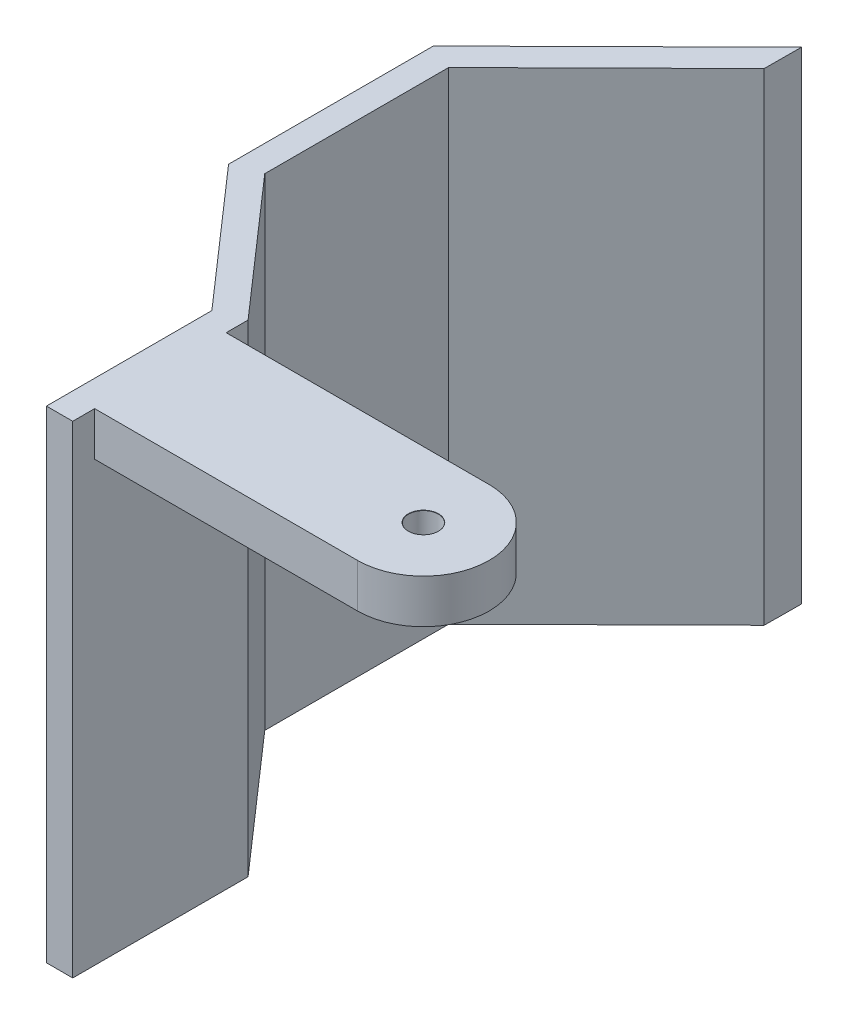
ISO-10303-21;
HEADER;
FILE_DESCRIPTION(('STEP AP214'),'2;1');
FILE_NAME('part.step','',(''),(''),'','','');
FILE_SCHEMA(('AUTOMOTIVE_DESIGN { 1 0 10303 214 1 1 1 1 }'));
ENDSEC;
DATA;
#1=APPLICATION_CONTEXT('core data for automotive mechanical design processes');
#2=APPLICATION_PROTOCOL_DEFINITION('international standard','automotive_design',2000,#1);
#3=PRODUCT_CONTEXT('',#1,'mechanical');
#4=PRODUCT('Part','Part','',(#3));
#5=PRODUCT_RELATED_PRODUCT_CATEGORY('part','',(#4));
#6=PRODUCT_DEFINITION_FORMATION('','',#4);
#7=PRODUCT_DEFINITION_CONTEXT('part definition',#1,'design');
#8=PRODUCT_DEFINITION('design','',#6,#7);
#9=PRODUCT_DEFINITION_SHAPE('','',#8);
#10=(LENGTH_UNIT() NAMED_UNIT(*) SI_UNIT(.MILLI.,.METRE.));
#11=(NAMED_UNIT(*) PLANE_ANGLE_UNIT() SI_UNIT($,.RADIAN.));
#12=(NAMED_UNIT(*) SI_UNIT($,.STERADIAN.) SOLID_ANGLE_UNIT());
#13=UNCERTAINTY_MEASURE_WITH_UNIT(LENGTH_MEASURE(1.E-05),#10,'distance_accuracy_value','');
#14=(GEOMETRIC_REPRESENTATION_CONTEXT(3) GLOBAL_UNCERTAINTY_ASSIGNED_CONTEXT((#13)) GLOBAL_UNIT_ASSIGNED_CONTEXT((#10,
#11,#12)) REPRESENTATION_CONTEXT('',''));
#15=CARTESIAN_POINT('',(0.,0.,0.));
#16=DIRECTION('',(0.,0.,1.));
#17=DIRECTION('',(1.,0.,0.));
#18=AXIS2_PLACEMENT_3D('',#15,#16,#17);
#19=CARTESIAN_POINT('',(0.,55.,0.));
#20=DIRECTION('',(0.,0.,1.));
#21=DIRECTION('',(1.,0.,0.));
#22=AXIS2_PLACEMENT_3D('',#19,#20,#21);
#23=PLANE('',#22);
#24=DIRECTION('',(-1.,0.,0.));
#25=VECTOR('',#24,1.);
#26=CARTESIAN_POINT('',(0.,0.,0.));
#27=LINE('',#26,#25);
#28=CARTESIAN_POINT('',(3.,0.,0.));
#29=VERTEX_POINT('',#28);
#30=CARTESIAN_POINT('',(0.,0.,0.));
#31=VERTEX_POINT('',#30);
#32=EDGE_CURVE('E158',#29,#31,#27,.T.);
#33=ORIENTED_EDGE('',*,*,#32,.F.);
#34=DIRECTION('',(0.,-1.,0.));
#35=VECTOR('',#34,1.);
#36=CARTESIAN_POINT('',(3.,55.,0.));
#37=LINE('',#36,#35);
#38=CARTESIAN_POINT('',(3.,55.,0.));
#39=VERTEX_POINT('',#38);
#40=EDGE_CURVE('E11',#39,#29,#37,.T.);
#41=ORIENTED_EDGE('',*,*,#40,.F.);
#42=DIRECTION('',(-1.,0.,0.));
#43=VECTOR('',#42,1.);
#44=CARTESIAN_POINT('',(0.,55.,0.));
#45=LINE('',#44,#43);
#46=CARTESIAN_POINT('',(0.,55.,0.));
#47=VERTEX_POINT('',#46);
#48=EDGE_CURVE('E181',#39,#47,#45,.T.);
#49=ORIENTED_EDGE('',*,*,#48,.T.);
#50=DIRECTION('',(0.,-1.,0.));
#51=VECTOR('',#50,1.);
#52=CARTESIAN_POINT('',(0.,55.,0.));
#53=LINE('',#52,#51);
#54=EDGE_CURVE('E65',#47,#31,#53,.T.);
#55=ORIENTED_EDGE('',*,*,#54,.T.);
#56=EDGE_LOOP('',(#33,#41,#49,#55));
#57=FACE_BOUND('',#56,.T.);
#58=ADVANCED_FACE('F41',(#57),#23,.T.);
#59=CARTESIAN_POINT('',(3.,55.,0.));
#60=DIRECTION('',(-1.,0.,0.));
#61=DIRECTION('',(0.,0.,1.));
#62=AXIS2_PLACEMENT_3D('',#59,#60,#61);
#63=PLANE('',#62);
#64=DIRECTION('',(0.,0.,-1.));
#65=VECTOR('',#64,1.);
#66=CARTESIAN_POINT('',(3.,55.,0.));
#67=LINE('',#66,#65);
#68=CARTESIAN_POINT('',(3.,55.,-17.5));
#69=VERTEX_POINT('',#68);
#70=CARTESIAN_POINT('',(3.,55.,-20.));
#71=VERTEX_POINT('',#70);
#72=EDGE_CURVE('E237',#69,#71,#67,.T.);
#73=ORIENTED_EDGE('',*,*,#72,.F.);
#74=DIRECTION('',(0.,1.,0.));
#75=VECTOR('',#74,1.);
#76=CARTESIAN_POINT('',(3.,50.,-17.5));
#77=LINE('',#76,#75);
#78=CARTESIAN_POINT('',(3.,50.,-17.5));
#79=VERTEX_POINT('',#78);
#80=EDGE_CURVE('E161',#79,#69,#77,.T.);
#81=ORIENTED_EDGE('',*,*,#80,.F.);
#82=DIRECTION('',(0.,0.,1.));
#83=VECTOR('',#82,1.);
#84=CARTESIAN_POINT('',(3.,50.,0.));
#85=LINE('',#84,#83);
#86=CARTESIAN_POINT('',(3.,50.,-2.5));
#87=VERTEX_POINT('',#86);
#88=EDGE_CURVE('E249',#79,#87,#85,.T.);
#89=ORIENTED_EDGE('',*,*,#88,.T.);
#90=DIRECTION('',(0.,1.,0.));
#91=VECTOR('',#90,1.);
#92=CARTESIAN_POINT('',(3.,50.,-2.5));
#93=LINE('',#92,#91);
#94=CARTESIAN_POINT('',(3.,55.,-2.5));
#95=VERTEX_POINT('',#94);
#96=EDGE_CURVE('E241',#87,#95,#93,.T.);
#97=ORIENTED_EDGE('',*,*,#96,.T.);
#98=EDGE_CURVE('E236',#39,#95,#67,.T.);
#99=ORIENTED_EDGE('',*,*,#98,.F.);
#100=ORIENTED_EDGE('',*,*,#40,.T.);
#101=DIRECTION('',(0.,0.,-1.));
#102=VECTOR('',#101,1.);
#103=CARTESIAN_POINT('',(3.,0.,0.));
#104=LINE('',#103,#102);
#105=CARTESIAN_POINT('',(3.,0.,-20.));
#106=VERTEX_POINT('',#105);
#107=EDGE_CURVE('E160',#29,#106,#104,.T.);
#108=ORIENTED_EDGE('',*,*,#107,.T.);
#109=DIRECTION('',(0.,-1.,0.));
#110=VECTOR('',#109,1.);
#111=CARTESIAN_POINT('',(3.,55.,-20.));
#112=LINE('',#111,#110);
#113=EDGE_CURVE('E49',#71,#106,#112,.T.);
#114=ORIENTED_EDGE('',*,*,#113,.F.);
#115=EDGE_LOOP('',(#73,#81,#89,#97,#99,#100,#108,#114));
#116=FACE_BOUND('',#115,.T.);
#117=ADVANCED_FACE('F244',(#116),#63,.F.);
#118=CARTESIAN_POINT('',(11.6103440031896,55.,-10.1759094573042));
#119=DIRECTION('',(-0.752035287081566,0.,0.659122846656181));
#120=DIRECTION('',(0.659122846656181,0.,0.752035287081566));
#121=AXIS2_PLACEMENT_3D('',#118,#119,#120);
#122=PLANE('',#121);
#123=DIRECTION('',(-0.659122846656181,0.,-0.752035287081566));
#124=VECTOR('',#123,1.);
#125=CARTESIAN_POINT('',(11.6103440031896,0.,-10.1759094573042));
#126=LINE('',#125,#124);
#127=CARTESIAN_POINT('',(-10.505514798512,0.,-35.409303061196));
#128=VERTEX_POINT('',#127);
#129=EDGE_CURVE('E163',#106,#128,#126,.T.);
#130=ORIENTED_EDGE('',*,*,#129,.T.);
#131=DIRECTION('',(0.,-1.,0.));
#132=VECTOR('',#131,1.);
#133=CARTESIAN_POINT('',(-10.505514798512,55.,-35.409303061196));
#134=LINE('',#133,#132);
#135=CARTESIAN_POINT('',(-10.505514798512,55.,-35.409303061196));
#136=VERTEX_POINT('',#135);
#137=EDGE_CURVE('E193',#136,#128,#134,.T.);
#138=ORIENTED_EDGE('',*,*,#137,.F.);
#139=DIRECTION('',(-0.659122846656181,0.,-0.752035287081566));
#140=VECTOR('',#139,1.);
#141=CARTESIAN_POINT('',(11.6103440031896,55.,-10.1759094573042));
#142=LINE('',#141,#140);
#143=EDGE_CURVE('E203',#71,#136,#142,.T.);
#144=ORIENTED_EDGE('',*,*,#143,.F.);
#145=ORIENTED_EDGE('',*,*,#113,.T.);
#146=EDGE_LOOP('',(#130,#138,#144,#145));
#147=FACE_BOUND('',#146,.T.);
#148=ADVANCED_FACE('F201',(#147),#122,.F.);
#149=CARTESIAN_POINT('',(-10.505514798512,55.,0.));
#150=DIRECTION('',(-1.,0.,0.));
#151=DIRECTION('',(0.,0.,1.));
#152=AXIS2_PLACEMENT_3D('',#149,#150,#151);
#153=PLANE('',#152);
#154=DIRECTION('',(0.,0.,-1.));
#155=VECTOR('',#154,1.);
#156=CARTESIAN_POINT('',(-10.505514798512,0.,0.));
#157=LINE('',#156,#155);
#158=CARTESIAN_POINT('',(-10.505514798512,0.,-56.3844767940236));
#159=VERTEX_POINT('',#158);
#160=EDGE_CURVE('E165',#128,#159,#157,.T.);
#161=ORIENTED_EDGE('',*,*,#160,.T.);
#162=DIRECTION('',(0.,-1.,0.));
#163=VECTOR('',#162,1.);
#164=CARTESIAN_POINT('',(-10.505514798512,55.,-56.3844767940236));
#165=LINE('',#164,#163);
#166=CARTESIAN_POINT('',(-10.505514798512,55.,-56.3844767940236));
#167=VERTEX_POINT('',#166);
#168=EDGE_CURVE('E190',#167,#159,#165,.T.);
#169=ORIENTED_EDGE('',*,*,#168,.F.);
#170=DIRECTION('',(0.,0.,-1.));
#171=VECTOR('',#170,1.);
#172=CARTESIAN_POINT('',(-10.505514798512,55.,0.));
#173=LINE('',#172,#171);
#174=EDGE_CURVE('E223',#136,#167,#173,.T.);
#175=ORIENTED_EDGE('',*,*,#174,.F.);
#176=ORIENTED_EDGE('',*,*,#137,.T.);
#177=EDGE_LOOP('',(#161,#169,#175,#176));
#178=FACE_BOUND('',#177,.T.);
#179=ADVANCED_FACE('F214',(#178),#153,.F.);
#180=CARTESIAN_POINT('',(-33.3838448037325,55.,-33.7632066765023));
#181=DIRECTION('',(-0.70310060646766,0.,-0.711090386086614));
#182=DIRECTION('',(-0.711090386086614,0.,0.70310060646766));
#183=AXIS2_PLACEMENT_3D('',#180,#181,#182);
#184=PLANE('',#183);
#185=DIRECTION('',(0.711090386086614,0.,-0.70310060646766));
#186=VECTOR('',#185,1.);
#187=CARTESIAN_POINT('',(-33.3838448037325,0.,-33.7632066765023));
#188=LINE('',#187,#186);
#189=CARTESIAN_POINT('',(7.59252972399853,0.,-74.2791725016744));
#190=VERTEX_POINT('',#189);
#191=EDGE_CURVE('E167',#159,#190,#188,.T.);
#192=ORIENTED_EDGE('',*,*,#191,.T.);
#193=DIRECTION('',(0.,-1.,0.));
#194=VECTOR('',#193,1.);
#195=CARTESIAN_POINT('',(7.59252972399853,55.,-74.2791725016744));
#196=LINE('',#195,#194);
#197=CARTESIAN_POINT('',(7.59252972399853,55.,-74.2791725016744));
#198=VERTEX_POINT('',#197);
#199=EDGE_CURVE('E187',#198,#190,#196,.T.);
#200=ORIENTED_EDGE('',*,*,#199,.F.);
#201=DIRECTION('',(0.711090386086614,0.,-0.70310060646766));
#202=VECTOR('',#201,1.);
#203=CARTESIAN_POINT('',(-33.3838448037325,55.,-33.7632066765023));
#204=LINE('',#203,#202);
#205=EDGE_CURVE('E220',#167,#198,#204,.T.);
#206=ORIENTED_EDGE('',*,*,#205,.F.);
#207=ORIENTED_EDGE('',*,*,#168,.T.);
#208=EDGE_LOOP('',(#192,#200,#206,#207));
#209=FACE_BOUND('',#208,.T.);
#210=ADVANCED_FACE('F218',(#209),#184,.F.);
#211=CARTESIAN_POINT('',(7.17264443633418,55.,0.0405234148945547));
#212=DIRECTION('',(-0.999984040728061,0.,-0.00564962734874768));
#213=DIRECTION('',(-0.00564962734874768,0.,0.999984040728061));
#214=AXIS2_PLACEMENT_3D('',#211,#212,#213);
#215=PLANE('',#214);
#216=DIRECTION('',(0.00564962734874768,0.,-0.999984040728061));
#217=VECTOR('',#216,1.);
#218=CARTESIAN_POINT('',(7.17264443633418,0.,0.0405234148945547));
#219=LINE('',#218,#217);
#220=CARTESIAN_POINT('',(7.61649906285539,0.,-78.5217454793372));
#221=VERTEX_POINT('',#220);
#222=EDGE_CURVE('E169',#190,#221,#219,.T.);
#223=ORIENTED_EDGE('',*,*,#222,.T.);
#224=DIRECTION('',(0.,-1.,0.));
#225=VECTOR('',#224,1.);
#226=CARTESIAN_POINT('',(7.61649906285539,55.,-78.5217454793372));
#227=LINE('',#226,#225);
#228=CARTESIAN_POINT('',(7.61649906285539,55.,-78.5217454793372));
#229=VERTEX_POINT('',#228);
#230=EDGE_CURVE('E185',#229,#221,#227,.T.);
#231=ORIENTED_EDGE('',*,*,#230,.F.);
#232=DIRECTION('',(0.00564962734874768,0.,-0.999984040728061));
#233=VECTOR('',#232,1.);
#234=CARTESIAN_POINT('',(7.17264443633418,55.,0.0405234148945547));
#235=LINE('',#234,#233);
#236=EDGE_CURVE('E222',#198,#229,#235,.T.);
#237=ORIENTED_EDGE('',*,*,#236,.F.);
#238=ORIENTED_EDGE('',*,*,#199,.T.);
#239=EDGE_LOOP('',(#223,#231,#237,#238));
#240=FACE_BOUND('',#239,.T.);
#241=ADVANCED_FACE('F318',(#240),#215,.F.);
#242=CARTESIAN_POINT('',(-35.4931466231355,55.,-35.8964778347622));
#243=DIRECTION('',(-0.70310060646766,0.,-0.711090386086614));
#244=DIRECTION('',(-0.711090386086614,0.,0.70310060646766));
#245=AXIS2_PLACEMENT_3D('',#242,#243,#244);
#246=PLANE('',#245);
#247=DIRECTION('',(0.711090386086614,0.,-0.70310060646766));
#248=VECTOR('',#247,1.);
#249=CARTESIAN_POINT('',(-35.4931466231355,0.,-35.8964778347622));
#250=LINE('',#249,#248);
#251=CARTESIAN_POINT('',(-13.505514798512,0.,-57.6370576164122));
#252=VERTEX_POINT('',#251);
#253=EDGE_CURVE('E172',#252,#221,#250,.T.);
#254=ORIENTED_EDGE('',*,*,#253,.F.);
#255=DIRECTION('',(0.,-1.,0.));
#256=VECTOR('',#255,1.);
#257=CARTESIAN_POINT('',(-13.505514798512,55.,-57.6370576164122));
#258=LINE('',#257,#256);
#259=CARTESIAN_POINT('',(-13.505514798512,55.,-57.6370576164122));
#260=VERTEX_POINT('',#259);
#261=EDGE_CURVE('E140',#260,#252,#258,.T.);
#262=ORIENTED_EDGE('',*,*,#261,.F.);
#263=DIRECTION('',(0.711090386086614,0.,-0.70310060646766));
#264=VECTOR('',#263,1.);
#265=CARTESIAN_POINT('',(-35.4931466231355,55.,-35.8964778347622));
#266=LINE('',#265,#264);
#267=EDGE_CURVE('E150',#260,#229,#266,.T.);
#268=ORIENTED_EDGE('',*,*,#267,.T.);
#269=ORIENTED_EDGE('',*,*,#230,.T.);
#270=EDGE_LOOP('',(#254,#262,#268,#269));
#271=FACE_BOUND('',#270,.T.);
#272=ADVANCED_FACE('F230',(#271),#246,.T.);
#273=CARTESIAN_POINT('',(-13.505514798512,55.,0.));
#274=DIRECTION('',(-1.,0.,0.));
#275=DIRECTION('',(0.,0.,1.));
#276=AXIS2_PLACEMENT_3D('',#273,#274,#275);
#277=PLANE('',#276);
#278=DIRECTION('',(0.,0.,-1.));
#279=VECTOR('',#278,1.);
#280=CARTESIAN_POINT('',(-13.505514798512,0.,0.));
#281=LINE('',#280,#279);
#282=CARTESIAN_POINT('',(-13.505514798512,0.,-34.2806907812103));
#283=VERTEX_POINT('',#282);
#284=EDGE_CURVE('E135',#283,#252,#281,.T.);
#285=ORIENTED_EDGE('',*,*,#284,.F.);
#286=DIRECTION('',(0.,-1.,0.));
#287=VECTOR('',#286,1.);
#288=CARTESIAN_POINT('',(-13.505514798512,55.,-34.2806907812103));
#289=LINE('',#288,#287);
#290=CARTESIAN_POINT('',(-13.505514798512,55.,-34.2806907812103));
#291=VERTEX_POINT('',#290);
#292=EDGE_CURVE('E130',#291,#283,#289,.T.);
#293=ORIENTED_EDGE('',*,*,#292,.F.);
#294=DIRECTION('',(0.,0.,-1.));
#295=VECTOR('',#294,1.);
#296=CARTESIAN_POINT('',(-13.505514798512,55.,0.));
#297=LINE('',#296,#295);
#298=EDGE_CURVE('E133',#291,#260,#297,.T.);
#299=ORIENTED_EDGE('',*,*,#298,.T.);
#300=ORIENTED_EDGE('',*,*,#261,.T.);
#301=EDGE_LOOP('',(#285,#293,#299,#300));
#302=FACE_BOUND('',#301,.T.);
#303=ADVANCED_FACE('F132',(#302),#277,.T.);
#304=CARTESIAN_POINT('',(9.35423814194485,55.,-8.19854091733569));
#305=DIRECTION('',(-0.752035287081566,0.,0.659122846656181));
#306=DIRECTION('',(0.659122846656181,0.,0.752035287081566));
#307=AXIS2_PLACEMENT_3D('',#304,#305,#306);
#308=PLANE('',#307);
#309=DIRECTION('',(-0.659122846656181,0.,-0.752035287081566));
#310=VECTOR('',#309,1.);
#311=CARTESIAN_POINT('',(9.35423814194485,0.,-8.19854091733569));
#312=LINE('',#311,#310);
#313=CARTESIAN_POINT('',(0.,0.,-18.8713877200143));
#314=VERTEX_POINT('',#313);
#315=EDGE_CURVE('E176',#314,#283,#312,.T.);
#316=ORIENTED_EDGE('',*,*,#315,.F.);
#317=DIRECTION('',(0.,-1.,0.));
#318=VECTOR('',#317,1.);
#319=CARTESIAN_POINT('',(0.,55.,-18.8713877200143));
#320=LINE('',#319,#318);
#321=CARTESIAN_POINT('',(0.,55.,-18.8713877200143));
#322=VERTEX_POINT('',#321);
#323=EDGE_CURVE('E141',#322,#314,#320,.T.);
#324=ORIENTED_EDGE('',*,*,#323,.F.);
#325=DIRECTION('',(-0.659122846656181,0.,-0.752035287081566));
#326=VECTOR('',#325,1.);
#327=CARTESIAN_POINT('',(9.35423814194485,55.,-8.19854091733569));
#328=LINE('',#327,#326);
#329=EDGE_CURVE('E148',#322,#291,#328,.T.);
#330=ORIENTED_EDGE('',*,*,#329,.T.);
#331=ORIENTED_EDGE('',*,*,#292,.T.);
#332=EDGE_LOOP('',(#316,#324,#330,#331));
#333=FACE_BOUND('',#332,.T.);
#334=ADVANCED_FACE('F152',(#333),#308,.T.);
#335=CARTESIAN_POINT('',(0.,55.,0.));
#336=DIRECTION('',(-1.,0.,0.));
#337=DIRECTION('',(0.,0.,1.));
#338=AXIS2_PLACEMENT_3D('',#335,#336,#337);
#339=PLANE('',#338);
#340=DIRECTION('',(0.,0.,-1.));
#341=VECTOR('',#340,1.);
#342=CARTESIAN_POINT('',(0.,0.,0.));
#343=LINE('',#342,#341);
#344=EDGE_CURVE('E178',#31,#314,#343,.T.);
#345=ORIENTED_EDGE('',*,*,#344,.F.);
#346=ORIENTED_EDGE('',*,*,#54,.F.);
#347=DIRECTION('',(0.,0.,-1.));
#348=VECTOR('',#347,1.);
#349=CARTESIAN_POINT('',(0.,55.,0.));
#350=LINE('',#349,#348);
#351=EDGE_CURVE('E153',#47,#322,#350,.T.);
#352=ORIENTED_EDGE('',*,*,#351,.T.);
#353=ORIENTED_EDGE('',*,*,#323,.T.);
#354=EDGE_LOOP('',(#345,#346,#352,#353));
#355=FACE_BOUND('',#354,.T.);
#356=ADVANCED_FACE('F232',(#355),#339,.T.);
#357=CARTESIAN_POINT('',(0.,55.,0.));
#358=DIRECTION('',(0.,1.,0.));
#359=DIRECTION('',(0.,0.,1.));
#360=AXIS2_PLACEMENT_3D('',#357,#358,#359);
#361=PLANE('',#360);
#362=CARTESIAN_POINT('',(33.,55.,-10.));
#363=DIRECTION('',(0.,1.,0.));
#364=DIRECTION('',(0.,0.,1.));
#365=AXIS2_PLACEMENT_3D('',#362,#363,#364);
#366=CIRCLE('',#365,1.725);
#367=CARTESIAN_POINT('',(33.,55.,-8.275));
#368=VERTEX_POINT('',#367);
#369=EDGE_CURVE('E287',#368,#368,#366,.T.);
#370=ORIENTED_EDGE('',*,*,#369,.F.);
#371=EDGE_LOOP('',(#370));
#372=FACE_BOUND('',#371,.T.);
#373=ORIENTED_EDGE('',*,*,#48,.F.);
#374=ORIENTED_EDGE('',*,*,#98,.T.);
#375=DIRECTION('',(-1.,0.,0.));
#376=VECTOR('',#375,1.);
#377=CARTESIAN_POINT('',(0.,55.,-2.5));
#378=LINE('',#377,#376);
#379=CARTESIAN_POINT('',(33.,55.,-2.5));
#380=VERTEX_POINT('',#379);
#381=EDGE_CURVE('E278',#380,#95,#378,.T.);
#382=ORIENTED_EDGE('',*,*,#381,.F.);
#383=CARTESIAN_POINT('',(33.,55.,-10.));
#384=DIRECTION('',(0.,1.,0.));
#385=DIRECTION('',(0.,0.,1.));
#386=AXIS2_PLACEMENT_3D('',#383,#384,#385);
#387=CIRCLE('',#386,7.5);
#388=CARTESIAN_POINT('',(33.,55.,-17.5));
#389=VERTEX_POINT('',#388);
#390=EDGE_CURVE('E279',#380,#389,#387,.T.);
#391=ORIENTED_EDGE('',*,*,#390,.T.);
#392=DIRECTION('',(-1.,0.,0.));
#393=VECTOR('',#392,1.);
#394=CARTESIAN_POINT('',(0.,55.,-17.5));
#395=LINE('',#394,#393);
#396=EDGE_CURVE('E56',#389,#69,#395,.T.);
#397=ORIENTED_EDGE('',*,*,#396,.T.);
#398=ORIENTED_EDGE('',*,*,#72,.T.);
#399=ORIENTED_EDGE('',*,*,#143,.T.);
#400=ORIENTED_EDGE('',*,*,#174,.T.);
#401=ORIENTED_EDGE('',*,*,#205,.T.);
#402=ORIENTED_EDGE('',*,*,#236,.T.);
#403=ORIENTED_EDGE('',*,*,#267,.F.);
#404=ORIENTED_EDGE('',*,*,#298,.F.);
#405=ORIENTED_EDGE('',*,*,#329,.F.);
#406=ORIENTED_EDGE('',*,*,#351,.F.);
#407=EDGE_LOOP('',(#373,#374,#382,#391,#397,#398,#399,#400,#401,#402,#403,#404,#405,#406));
#408=FACE_BOUND('',#407,.T.);
#409=ADVANCED_FACE('F146',(#372,#408),#361,.T.);
#410=CARTESIAN_POINT('',(0.,0.,0.));
#411=DIRECTION('',(0.,1.,0.));
#412=DIRECTION('',(0.,0.,1.));
#413=AXIS2_PLACEMENT_3D('',#410,#411,#412);
#414=PLANE('',#413);
#415=ORIENTED_EDGE('',*,*,#32,.T.);
#416=ORIENTED_EDGE('',*,*,#344,.T.);
#417=ORIENTED_EDGE('',*,*,#315,.T.);
#418=ORIENTED_EDGE('',*,*,#284,.T.);
#419=ORIENTED_EDGE('',*,*,#253,.T.);
#420=ORIENTED_EDGE('',*,*,#222,.F.);
#421=ORIENTED_EDGE('',*,*,#191,.F.);
#422=ORIENTED_EDGE('',*,*,#160,.F.);
#423=ORIENTED_EDGE('',*,*,#129,.F.);
#424=ORIENTED_EDGE('',*,*,#107,.F.);
#425=EDGE_LOOP('',(#415,#416,#417,#418,#419,#420,#421,#422,#423,#424));
#426=FACE_BOUND('',#425,.T.);
#427=ADVANCED_FACE('F209',(#426),#414,.F.);
#428=CARTESIAN_POINT('',(0.,50.,-17.5));
#429=DIRECTION('',(0.,0.,-1.));
#430=DIRECTION('',(-1.,0.,0.));
#431=AXIS2_PLACEMENT_3D('',#428,#429,#430);
#432=PLANE('',#431);
#433=ORIENTED_EDGE('',*,*,#396,.F.);
#434=DIRECTION('',(0.,1.,0.));
#435=VECTOR('',#434,1.);
#436=CARTESIAN_POINT('',(33.,50.,-17.5));
#437=LINE('',#436,#435);
#438=CARTESIAN_POINT('',(33.,50.,-17.5));
#439=VERTEX_POINT('',#438);
#440=EDGE_CURVE('E254',#439,#389,#437,.T.);
#441=ORIENTED_EDGE('',*,*,#440,.F.);
#442=DIRECTION('',(-1.,0.,0.));
#443=VECTOR('',#442,1.);
#444=CARTESIAN_POINT('',(0.,50.,-17.5));
#445=LINE('',#444,#443);
#446=EDGE_CURVE('E267',#439,#79,#445,.T.);
#447=ORIENTED_EDGE('',*,*,#446,.T.);
#448=ORIENTED_EDGE('',*,*,#80,.T.);
#449=EDGE_LOOP('',(#433,#441,#447,#448));
#450=FACE_BOUND('',#449,.T.);
#451=ADVANCED_FACE('F300',(#450),#432,.T.);
#452=CARTESIAN_POINT('',(33.,50.,-10.));
#453=DIRECTION('',(0.,1.,0.));
#454=DIRECTION('',(0.,0.,1.));
#455=AXIS2_PLACEMENT_3D('',#452,#453,#454);
#456=CYLINDRICAL_SURFACE('',#455,7.5);
#457=ORIENTED_EDGE('',*,*,#390,.F.);
#458=DIRECTION('',(0.,1.,0.));
#459=VECTOR('',#458,1.);
#460=CARTESIAN_POINT('',(33.,50.,-2.5));
#461=LINE('',#460,#459);
#462=CARTESIAN_POINT('',(33.,50.,-2.5));
#463=VERTEX_POINT('',#462);
#464=EDGE_CURVE('E257',#463,#380,#461,.T.);
#465=ORIENTED_EDGE('',*,*,#464,.F.);
#466=CARTESIAN_POINT('',(33.,50.,-10.));
#467=DIRECTION('',(0.,1.,0.));
#468=DIRECTION('',(0.,0.,1.));
#469=AXIS2_PLACEMENT_3D('',#466,#467,#468);
#470=CIRCLE('',#469,7.5);
#471=EDGE_CURVE('E269',#463,#439,#470,.T.);
#472=ORIENTED_EDGE('',*,*,#471,.T.);
#473=ORIENTED_EDGE('',*,*,#440,.T.);
#474=EDGE_LOOP('',(#457,#465,#472,#473));
#475=FACE_BOUND('',#474,.T.);
#476=ADVANCED_FACE('F351',(#475),#456,.T.);
#477=CARTESIAN_POINT('',(0.,50.,-2.5));
#478=DIRECTION('',(0.,0.,-1.));
#479=DIRECTION('',(-1.,0.,0.));
#480=AXIS2_PLACEMENT_3D('',#477,#478,#479);
#481=PLANE('',#480);
#482=ORIENTED_EDGE('',*,*,#381,.T.);
#483=ORIENTED_EDGE('',*,*,#96,.F.);
#484=DIRECTION('',(-1.,0.,0.));
#485=VECTOR('',#484,1.);
#486=CARTESIAN_POINT('',(0.,50.,-2.5));
#487=LINE('',#486,#485);
#488=EDGE_CURVE('E274',#463,#87,#487,.T.);
#489=ORIENTED_EDGE('',*,*,#488,.F.);
#490=ORIENTED_EDGE('',*,*,#464,.T.);
#491=EDGE_LOOP('',(#482,#483,#489,#490));
#492=FACE_BOUND('',#491,.T.);
#493=ADVANCED_FACE('F357',(#492),#481,.F.);
#494=CARTESIAN_POINT('',(33.,50.,-10.));
#495=DIRECTION('',(0.,1.,0.));
#496=DIRECTION('',(0.,0.,1.));
#497=AXIS2_PLACEMENT_3D('',#494,#495,#496);
#498=PLANE('',#497);
#499=CARTESIAN_POINT('',(33.,50.,-10.));
#500=DIRECTION('',(0.,1.,0.));
#501=DIRECTION('',(0.,0.,1.));
#502=AXIS2_PLACEMENT_3D('',#499,#500,#501);
#503=CIRCLE('',#502,1.7);
#504=CARTESIAN_POINT('',(33.,50.,-8.30000000000001));
#505=VERTEX_POINT('',#504);
#506=EDGE_CURVE('E44',#505,#505,#503,.T.);
#507=ORIENTED_EDGE('',*,*,#506,.T.);
#508=EDGE_LOOP('',(#507));
#509=FACE_BOUND('',#508,.T.);
#510=ORIENTED_EDGE('',*,*,#88,.F.);
#511=ORIENTED_EDGE('',*,*,#446,.F.);
#512=ORIENTED_EDGE('',*,*,#471,.F.);
#513=ORIENTED_EDGE('',*,*,#488,.T.);
#514=EDGE_LOOP('',(#510,#511,#512,#513));
#515=FACE_BOUND('',#514,.T.);
#516=ADVANCED_FACE('F364',(#509,#515),#498,.F.);
#517=CARTESIAN_POINT('',(33.,55.,-10.));
#518=DIRECTION('',(0.,1.,0.));
#519=DIRECTION('',(0.,0.,1.));
#520=AXIS2_PLACEMENT_3D('',#517,#518,#519);
#521=CYLINDRICAL_SURFACE('',#520,1.7);
#522=CARTESIAN_POINT('',(33.,54.975,-10.));
#523=DIRECTION('',(0.,1.,0.));
#524=DIRECTION('',(0.,0.,1.));
#525=AXIS2_PLACEMENT_3D('',#522,#523,#524);
#526=CIRCLE('',#525,1.7);
#527=CARTESIAN_POINT('',(33.,54.975,-8.30000000000001));
#528=VERTEX_POINT('',#527);
#529=EDGE_CURVE('E284',#528,#528,#526,.T.);
#530=ORIENTED_EDGE('',*,*,#529,.T.);
#531=EDGE_LOOP('',(#530));
#532=FACE_BOUND('',#531,.T.);
#533=ORIENTED_EDGE('',*,*,#506,.F.);
#534=EDGE_LOOP('',(#533));
#535=FACE_BOUND('',#534,.T.);
#536=ADVANCED_FACE('F370',(#532,#535),#521,.F.);
#537=CARTESIAN_POINT('',(33.,55.,-10.));
#538=DIRECTION('',(0.,1.,0.));
#539=DIRECTION('',(0.,0.,1.));
#540=AXIS2_PLACEMENT_3D('',#537,#538,#539);
#541=CONICAL_SURFACE('',#540,1.725,0.785398163397587);
#542=ORIENTED_EDGE('',*,*,#529,.F.);
#543=EDGE_LOOP('',(#542));
#544=FACE_BOUND('',#543,.T.);
#545=ORIENTED_EDGE('',*,*,#369,.T.);
#546=EDGE_LOOP('',(#545));
#547=FACE_BOUND('',#546,.T.);
#548=ADVANCED_FACE('F291',(#544,#547),#541,.F.);
#549=CLOSED_SHELL('',(#58,#117,#148,#179,#210,#241,#272,#303,#334,#356,#409,#427,#451,#476,#493,
#516,#536,#548));
#550=MANIFOLD_SOLID_BREP('B2',#549);
#551=ADVANCED_BREP_SHAPE_REPRESENTATION('',(#18,#550),#14);
#552=SHAPE_DEFINITION_REPRESENTATION(#9,#551);
ENDSEC;
END-ISO-10303-21;
